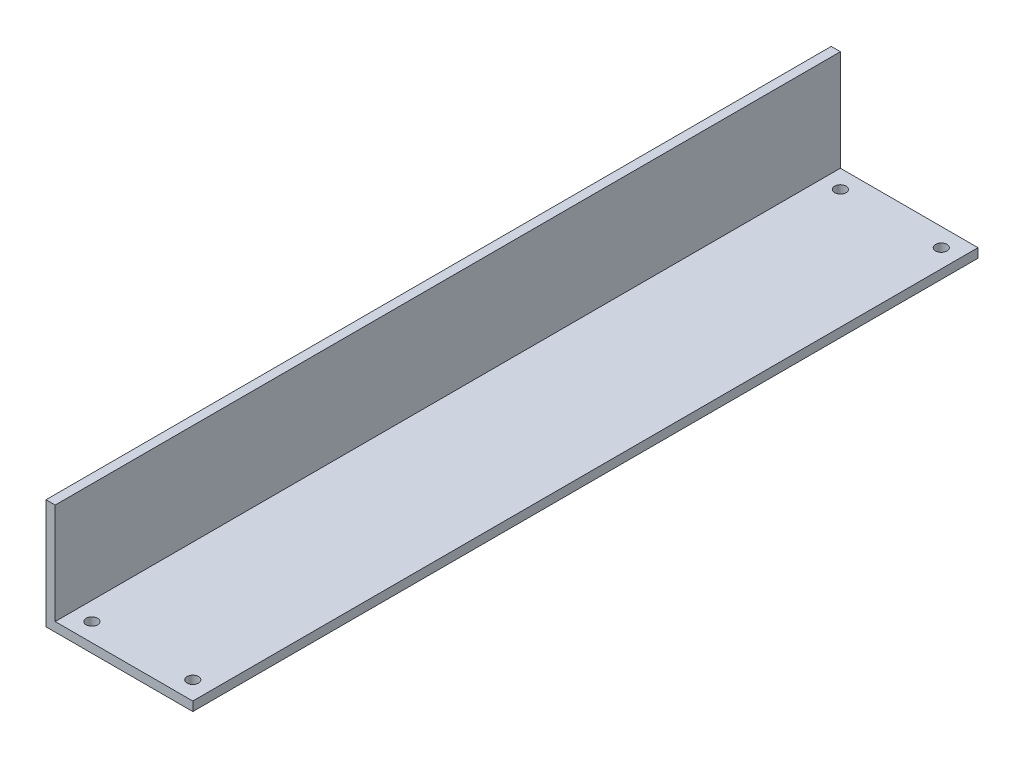
ISO-10303-21;
HEADER;
FILE_DESCRIPTION(('STEP AP214'),'2;1');
FILE_NAME('part.step','',(''),(''),'','','');
FILE_SCHEMA(('AUTOMOTIVE_DESIGN { 1 0 10303 214 1 1 1 1 }'));
ENDSEC;
DATA;
#1=APPLICATION_CONTEXT('core data for automotive mechanical design processes');
#2=APPLICATION_PROTOCOL_DEFINITION('international standard','automotive_design',2000,#1);
#3=PRODUCT_CONTEXT('',#1,'mechanical');
#4=PRODUCT('Part','Part','',(#3));
#5=PRODUCT_RELATED_PRODUCT_CATEGORY('part','',(#4));
#6=PRODUCT_DEFINITION_FORMATION('','',#4);
#7=PRODUCT_DEFINITION_CONTEXT('part definition',#1,'design');
#8=PRODUCT_DEFINITION('design','',#6,#7);
#9=PRODUCT_DEFINITION_SHAPE('','',#8);
#10=(LENGTH_UNIT() NAMED_UNIT(*) SI_UNIT(.MILLI.,.METRE.));
#11=(NAMED_UNIT(*) PLANE_ANGLE_UNIT() SI_UNIT($,.RADIAN.));
#12=(NAMED_UNIT(*) SI_UNIT($,.STERADIAN.) SOLID_ANGLE_UNIT());
#13=UNCERTAINTY_MEASURE_WITH_UNIT(LENGTH_MEASURE(1.E-05),#10,'distance_accuracy_value','');
#14=(GEOMETRIC_REPRESENTATION_CONTEXT(3) GLOBAL_UNCERTAINTY_ASSIGNED_CONTEXT((#13)) GLOBAL_UNIT_ASSIGNED_CONTEXT((#10,
#11,#12)) REPRESENTATION_CONTEXT('',''));
#15=CARTESIAN_POINT('',(0.,0.,0.));
#16=DIRECTION('',(0.,0.,1.));
#17=DIRECTION('',(1.,0.,0.));
#18=AXIS2_PLACEMENT_3D('',#15,#16,#17);
#19=CARTESIAN_POINT('',(25.4,76.2,683.199999999988));
#20=DIRECTION('',(0.,1.,0.));
#21=DIRECTION('',(0.,0.,1.));
#22=AXIS2_PLACEMENT_3D('',#19,#20,#21);
#23=PLANE('',#22);
#24=DIRECTION('',(0.,0.,-1.));
#25=VECTOR('',#24,1.);
#26=CARTESIAN_POINT('',(0.,76.2,683.199999999988));
#27=LINE('',#26,#25);
#28=CARTESIAN_POINT('',(0.,76.2,543.499999999988));
#29=VERTEX_POINT('',#28);
#30=CARTESIAN_POINT('',(0.,76.2,0.));
#31=VERTEX_POINT('',#30);
#32=EDGE_CURVE('E92',#29,#31,#27,.T.);
#33=ORIENTED_EDGE('',*,*,#32,.F.);
#34=DIRECTION('',(1.,0.,0.));
#35=VECTOR('',#34,1.);
#36=CARTESIAN_POINT('',(25.4,76.2,543.499999999988));
#37=LINE('',#36,#35);
#38=CARTESIAN_POINT('',(6.34999999999998,76.2,543.499999999988));
#39=VERTEX_POINT('',#38);
#40=EDGE_CURVE('E142',#29,#39,#37,.T.);
#41=ORIENTED_EDGE('',*,*,#40,.T.);
#42=DIRECTION('',(0.,0.,-1.));
#43=VECTOR('',#42,1.);
#44=CARTESIAN_POINT('',(6.34999999999998,76.2,683.199999999988));
#45=LINE('',#44,#43);
#46=CARTESIAN_POINT('',(6.34999999999998,76.2,0.));
#47=VERTEX_POINT('',#46);
#48=EDGE_CURVE('E62',#39,#47,#45,.T.);
#49=ORIENTED_EDGE('',*,*,#48,.T.);
#50=DIRECTION('',(1.,0.,0.));
#51=VECTOR('',#50,1.);
#52=CARTESIAN_POINT('',(25.4,76.2,0.));
#53=LINE('',#52,#51);
#54=EDGE_CURVE('E134',#31,#47,#53,.T.);
#55=ORIENTED_EDGE('',*,*,#54,.F.);
#56=EDGE_LOOP('',(#33,#41,#49,#55));
#57=FACE_BOUND('',#56,.T.);
#58=ADVANCED_FACE('F42',(#57),#23,.T.);
#59=CARTESIAN_POINT('',(0.,-109.647675221646,683.199999999988));
#60=DIRECTION('',(-1.,0.,0.));
#61=DIRECTION('',(0.,-1.,0.));
#62=AXIS2_PLACEMENT_3D('',#59,#60,#61);
#63=PLANE('',#62);
#64=DIRECTION('',(0.,0.,-1.));
#65=VECTOR('',#64,1.);
#66=CARTESIAN_POINT('',(0.,0.,683.199999999988));
#67=LINE('',#66,#65);
#68=CARTESIAN_POINT('',(0.,0.,543.499999999988));
#69=VERTEX_POINT('',#68);
#70=CARTESIAN_POINT('',(0.,0.,0.));
#71=VERTEX_POINT('',#70);
#72=EDGE_CURVE('E148',#69,#71,#67,.T.);
#73=ORIENTED_EDGE('',*,*,#72,.F.);
#74=DIRECTION('',(0.,1.,0.));
#75=VECTOR('',#74,1.);
#76=CARTESIAN_POINT('',(0.,-109.647675221646,543.499999999988));
#77=LINE('',#76,#75);
#78=EDGE_CURVE('E99',#69,#29,#77,.T.);
#79=ORIENTED_EDGE('',*,*,#78,.T.);
#80=ORIENTED_EDGE('',*,*,#32,.T.);
#81=DIRECTION('',(0.,1.,0.));
#82=VECTOR('',#81,1.);
#83=CARTESIAN_POINT('',(0.,-109.647675221646,0.));
#84=LINE('',#83,#82);
#85=EDGE_CURVE('E139',#71,#31,#84,.T.);
#86=ORIENTED_EDGE('',*,*,#85,.F.);
#87=EDGE_LOOP('',(#73,#79,#80,#86));
#88=FACE_BOUND('',#87,.T.);
#89=ADVANCED_FACE('F189',(#88),#63,.T.);
#90=CARTESIAN_POINT('',(25.4,0.,683.199999999988));
#91=DIRECTION('',(0.,1.,0.));
#92=DIRECTION('',(0.,0.,1.));
#93=AXIS2_PLACEMENT_3D('',#90,#91,#92);
#94=PLANE('',#93);
#95=CARTESIAN_POINT('',(88.9,0.,12.7));
#96=DIRECTION('',(0.,-1.,0.));
#97=DIRECTION('',(0.,0.,-1.));
#98=AXIS2_PLACEMENT_3D('',#95,#96,#97);
#99=CIRCLE('',#98,3.96875000000006);
#100=CARTESIAN_POINT('',(88.9,0.,8.73124999999996));
#101=VERTEX_POINT('',#100);
#102=EDGE_CURVE('E172',#101,#101,#99,.T.);
#103=ORIENTED_EDGE('',*,*,#102,.F.);
#104=EDGE_LOOP('',(#103));
#105=FACE_BOUND('',#104,.T.);
#106=CARTESIAN_POINT('',(19.05,0.,12.7));
#107=DIRECTION('',(0.,-1.,0.));
#108=DIRECTION('',(0.,0.,-1.));
#109=AXIS2_PLACEMENT_3D('',#106,#107,#108);
#110=CIRCLE('',#109,3.96874999999995);
#111=CARTESIAN_POINT('',(19.05,0.,8.73125000000001));
#112=VERTEX_POINT('',#111);
#113=EDGE_CURVE('E162',#112,#112,#110,.T.);
#114=ORIENTED_EDGE('',*,*,#113,.F.);
#115=EDGE_LOOP('',(#114));
#116=FACE_BOUND('',#115,.T.);
#117=CARTESIAN_POINT('',(19.0500000000011,0.,530.799999999992));
#118=DIRECTION('',(0.,-1.,0.));
#119=DIRECTION('',(0.,0.,-1.));
#120=AXIS2_PLACEMENT_3D('',#117,#118,#119);
#121=CIRCLE('',#120,3.9687499999999);
#122=CARTESIAN_POINT('',(19.0500000000011,0.,526.831249999992));
#123=VERTEX_POINT('',#122);
#124=EDGE_CURVE('E159',#123,#123,#121,.T.);
#125=ORIENTED_EDGE('',*,*,#124,.F.);
#126=EDGE_LOOP('',(#125));
#127=FACE_BOUND('',#126,.T.);
#128=CARTESIAN_POINT('',(88.9000000000009,0.,530.799999999942));
#129=DIRECTION('',(0.,-1.,0.));
#130=DIRECTION('',(0.,0.,-1.));
#131=AXIS2_PLACEMENT_3D('',#128,#129,#130);
#132=CIRCLE('',#131,3.96875000000001);
#133=CARTESIAN_POINT('',(88.9000000000009,0.,526.831249999942));
#134=VERTEX_POINT('',#133);
#135=EDGE_CURVE('E156',#134,#134,#132,.T.);
#136=ORIENTED_EDGE('',*,*,#135,.F.);
#137=EDGE_LOOP('',(#136));
#138=FACE_BOUND('',#137,.T.);
#139=DIRECTION('',(1.,0.,0.));
#140=VECTOR('',#139,1.);
#141=CARTESIAN_POINT('',(25.4,0.,543.499999999988));
#142=LINE('',#141,#140);
#143=CARTESIAN_POINT('',(101.6,0.,543.499999999988));
#144=VERTEX_POINT('',#143);
#145=EDGE_CURVE('E52',#69,#144,#142,.T.);
#146=ORIENTED_EDGE('',*,*,#145,.F.);
#147=ORIENTED_EDGE('',*,*,#72,.T.);
#148=DIRECTION('',(1.,0.,0.));
#149=VECTOR('',#148,1.);
#150=CARTESIAN_POINT('',(25.4,0.,0.));
#151=LINE('',#150,#149);
#152=CARTESIAN_POINT('',(101.6,0.,0.));
#153=VERTEX_POINT('',#152);
#154=EDGE_CURVE('E137',#71,#153,#151,.T.);
#155=ORIENTED_EDGE('',*,*,#154,.T.);
#156=DIRECTION('',(0.,0.,-1.));
#157=VECTOR('',#156,1.);
#158=CARTESIAN_POINT('',(101.6,0.,683.199999999988));
#159=LINE('',#158,#157);
#160=EDGE_CURVE('E124',#144,#153,#159,.T.);
#161=ORIENTED_EDGE('',*,*,#160,.F.);
#162=EDGE_LOOP('',(#146,#147,#155,#161));
#163=FACE_BOUND('',#162,.T.);
#164=ADVANCED_FACE('F196',(#105,#116,#127,#138,#163),#94,.F.);
#165=CARTESIAN_POINT('',(101.6,-109.647675221646,683.199999999988));
#166=DIRECTION('',(1.,0.,0.));
#167=DIRECTION('',(0.,0.,-1.));
#168=AXIS2_PLACEMENT_3D('',#165,#166,#167);
#169=PLANE('',#168);
#170=DIRECTION('',(0.,0.,-1.));
#171=VECTOR('',#170,1.);
#172=CARTESIAN_POINT('',(101.6,6.34999999999999,683.199999999988));
#173=LINE('',#172,#171);
#174=CARTESIAN_POINT('',(101.6,6.34999999999999,543.499999999988));
#175=VERTEX_POINT('',#174);
#176=CARTESIAN_POINT('',(101.6,6.34999999999999,0.));
#177=VERTEX_POINT('',#176);
#178=EDGE_CURVE('E115',#175,#177,#173,.T.);
#179=ORIENTED_EDGE('',*,*,#178,.F.);
#180=DIRECTION('',(0.,-1.,0.));
#181=VECTOR('',#180,1.);
#182=CARTESIAN_POINT('',(101.6,-109.647675221646,543.499999999988));
#183=LINE('',#182,#181);
#184=EDGE_CURVE('E122',#175,#144,#183,.T.);
#185=ORIENTED_EDGE('',*,*,#184,.T.);
#186=ORIENTED_EDGE('',*,*,#160,.T.);
#187=DIRECTION('',(0.,-1.,0.));
#188=VECTOR('',#187,1.);
#189=CARTESIAN_POINT('',(101.6,-109.647675221646,0.));
#190=LINE('',#189,#188);
#191=EDGE_CURVE('E180',#177,#153,#190,.T.);
#192=ORIENTED_EDGE('',*,*,#191,.F.);
#193=EDGE_LOOP('',(#179,#185,#186,#192));
#194=FACE_BOUND('',#193,.T.);
#195=ADVANCED_FACE('F194',(#194),#169,.T.);
#196=CARTESIAN_POINT('',(25.4,6.34999999999999,683.199999999988));
#197=DIRECTION('',(0.,1.,0.));
#198=DIRECTION('',(0.,0.,1.));
#199=AXIS2_PLACEMENT_3D('',#196,#197,#198);
#200=PLANE('',#199);
#201=CARTESIAN_POINT('',(88.9,6.34999999999999,12.7));
#202=DIRECTION('',(0.,1.,0.));
#203=DIRECTION('',(0.,0.,1.));
#204=AXIS2_PLACEMENT_3D('',#201,#202,#203);
#205=CIRCLE('',#204,3.96875000000006);
#206=CARTESIAN_POINT('',(88.9,6.34999999999999,16.6687500000001));
#207=VERTEX_POINT('',#206);
#208=EDGE_CURVE('E46',#207,#207,#205,.T.);
#209=ORIENTED_EDGE('',*,*,#208,.F.);
#210=EDGE_LOOP('',(#209));
#211=FACE_BOUND('',#210,.T.);
#212=CARTESIAN_POINT('',(19.05,6.34999999999999,12.7));
#213=DIRECTION('',(0.,1.,0.));
#214=DIRECTION('',(0.,0.,1.));
#215=AXIS2_PLACEMENT_3D('',#212,#213,#214);
#216=CIRCLE('',#215,3.96874999999995);
#217=CARTESIAN_POINT('',(19.05,6.34999999999999,16.6687499999999));
#218=VERTEX_POINT('',#217);
#219=EDGE_CURVE('E160',#218,#218,#216,.T.);
#220=ORIENTED_EDGE('',*,*,#219,.F.);
#221=EDGE_LOOP('',(#220));
#222=FACE_BOUND('',#221,.T.);
#223=CARTESIAN_POINT('',(19.0500000000011,6.34999999999999,530.799999999992));
#224=DIRECTION('',(0.,1.,0.));
#225=DIRECTION('',(0.,0.,1.));
#226=AXIS2_PLACEMENT_3D('',#223,#224,#225);
#227=CIRCLE('',#226,3.9687499999999);
#228=CARTESIAN_POINT('',(19.0500000000011,6.34999999999999,534.768749999991));
#229=VERTEX_POINT('',#228);
#230=EDGE_CURVE('E157',#229,#229,#227,.T.);
#231=ORIENTED_EDGE('',*,*,#230,.F.);
#232=EDGE_LOOP('',(#231));
#233=FACE_BOUND('',#232,.T.);
#234=CARTESIAN_POINT('',(88.9000000000009,6.34999999999999,530.799999999942));
#235=DIRECTION('',(0.,1.,0.));
#236=DIRECTION('',(0.,0.,1.));
#237=AXIS2_PLACEMENT_3D('',#234,#235,#236);
#238=CIRCLE('',#237,3.96875000000001);
#239=CARTESIAN_POINT('',(88.9000000000009,6.34999999999999,534.768749999942));
#240=VERTEX_POINT('',#239);
#241=EDGE_CURVE('E144',#240,#240,#238,.T.);
#242=ORIENTED_EDGE('',*,*,#241,.F.);
#243=EDGE_LOOP('',(#242));
#244=FACE_BOUND('',#243,.T.);
#245=DIRECTION('',(0.,0.,-1.));
#246=VECTOR('',#245,1.);
#247=CARTESIAN_POINT('',(6.35,6.34999999999999,683.199999999988));
#248=LINE('',#247,#246);
#249=CARTESIAN_POINT('',(6.35,6.34999999999999,543.499999999988));
#250=VERTEX_POINT('',#249);
#251=CARTESIAN_POINT('',(6.35,6.34999999999999,0.));
#252=VERTEX_POINT('',#251);
#253=EDGE_CURVE('E68',#250,#252,#248,.T.);
#254=ORIENTED_EDGE('',*,*,#253,.F.);
#255=DIRECTION('',(1.,0.,0.));
#256=VECTOR('',#255,1.);
#257=CARTESIAN_POINT('',(25.4,6.34999999999999,543.499999999988));
#258=LINE('',#257,#256);
#259=EDGE_CURVE('E107',#250,#175,#258,.T.);
#260=ORIENTED_EDGE('',*,*,#259,.T.);
#261=ORIENTED_EDGE('',*,*,#178,.T.);
#262=DIRECTION('',(1.,0.,0.));
#263=VECTOR('',#262,1.);
#264=CARTESIAN_POINT('',(25.4,6.34999999999999,0.));
#265=LINE('',#264,#263);
#266=EDGE_CURVE('E112',#252,#177,#265,.T.);
#267=ORIENTED_EDGE('',*,*,#266,.F.);
#268=EDGE_LOOP('',(#254,#260,#261,#267));
#269=FACE_BOUND('',#268,.T.);
#270=ADVANCED_FACE('F110',(#211,#222,#233,#244,#269),#200,.T.);
#271=CARTESIAN_POINT('',(6.35000000000002,-109.647675221646,683.199999999988));
#272=DIRECTION('',(-1.,0.,0.));
#273=DIRECTION('',(0.,-1.,0.));
#274=AXIS2_PLACEMENT_3D('',#271,#272,#273);
#275=PLANE('',#274);
#276=DIRECTION('',(0.,1.,0.));
#277=VECTOR('',#276,1.);
#278=CARTESIAN_POINT('',(6.35000000000002,-109.647675221646,543.499999999988));
#279=LINE('',#278,#277);
#280=EDGE_CURVE('E12',#250,#39,#279,.T.);
#281=ORIENTED_EDGE('',*,*,#280,.F.);
#282=ORIENTED_EDGE('',*,*,#253,.T.);
#283=DIRECTION('',(0.,1.,0.));
#284=VECTOR('',#283,1.);
#285=CARTESIAN_POINT('',(6.35000000000002,-109.647675221646,0.));
#286=LINE('',#285,#284);
#287=EDGE_CURVE('E114',#252,#47,#286,.T.);
#288=ORIENTED_EDGE('',*,*,#287,.T.);
#289=ORIENTED_EDGE('',*,*,#48,.F.);
#290=EDGE_LOOP('',(#281,#282,#288,#289));
#291=FACE_BOUND('',#290,.T.);
#292=ADVANCED_FACE('F117',(#291),#275,.F.);
#293=CARTESIAN_POINT('',(25.4,-109.647675221646,0.));
#294=DIRECTION('',(0.,0.,1.));
#295=DIRECTION('',(1.,0.,0.));
#296=AXIS2_PLACEMENT_3D('',#293,#294,#295);
#297=PLANE('',#296);
#298=ORIENTED_EDGE('',*,*,#54,.T.);
#299=ORIENTED_EDGE('',*,*,#287,.F.);
#300=ORIENTED_EDGE('',*,*,#266,.T.);
#301=ORIENTED_EDGE('',*,*,#191,.T.);
#302=ORIENTED_EDGE('',*,*,#154,.F.);
#303=ORIENTED_EDGE('',*,*,#85,.T.);
#304=EDGE_LOOP('',(#298,#299,#300,#301,#302,#303));
#305=FACE_BOUND('',#304,.T.);
#306=ADVANCED_FACE('F188',(#305),#297,.F.);
#307=CARTESIAN_POINT('',(206.179160264318,95.9611999999439,543.499999999988));
#308=DIRECTION('',(0.,0.,1.));
#309=DIRECTION('',(1.,0.,0.));
#310=AXIS2_PLACEMENT_3D('',#307,#308,#309);
#311=PLANE('',#310);
#312=ORIENTED_EDGE('',*,*,#40,.F.);
#313=ORIENTED_EDGE('',*,*,#78,.F.);
#314=ORIENTED_EDGE('',*,*,#145,.T.);
#315=ORIENTED_EDGE('',*,*,#184,.F.);
#316=ORIENTED_EDGE('',*,*,#259,.F.);
#317=ORIENTED_EDGE('',*,*,#280,.T.);
#318=EDGE_LOOP('',(#312,#313,#314,#315,#316,#317));
#319=FACE_BOUND('',#318,.T.);
#320=ADVANCED_FACE('F44',(#319),#311,.T.);
#321=CARTESIAN_POINT('',(88.9000000000009,76.2,530.799999999942));
#322=DIRECTION('',(0.,-1.,0.));
#323=DIRECTION('',(0.,0.,-1.));
#324=AXIS2_PLACEMENT_3D('',#321,#322,#323);
#325=CYLINDRICAL_SURFACE('',#324,3.96875000000001);
#326=ORIENTED_EDGE('',*,*,#241,.T.);
#327=EDGE_LOOP('',(#326));
#328=FACE_BOUND('',#327,.T.);
#329=ORIENTED_EDGE('',*,*,#135,.T.);
#330=EDGE_LOOP('',(#329));
#331=FACE_BOUND('',#330,.T.);
#332=ADVANCED_FACE('F246',(#328,#331),#325,.F.);
#333=CARTESIAN_POINT('',(19.0500000000011,76.2,530.799999999992));
#334=DIRECTION('',(0.,-1.,0.));
#335=DIRECTION('',(0.,0.,-1.));
#336=AXIS2_PLACEMENT_3D('',#333,#334,#335);
#337=CYLINDRICAL_SURFACE('',#336,3.9687499999999);
#338=ORIENTED_EDGE('',*,*,#230,.T.);
#339=EDGE_LOOP('',(#338));
#340=FACE_BOUND('',#339,.T.);
#341=ORIENTED_EDGE('',*,*,#124,.T.);
#342=EDGE_LOOP('',(#341));
#343=FACE_BOUND('',#342,.T.);
#344=ADVANCED_FACE('F251',(#340,#343),#337,.F.);
#345=CARTESIAN_POINT('',(19.05,76.2,12.7));
#346=DIRECTION('',(0.,-1.,0.));
#347=DIRECTION('',(0.,0.,-1.));
#348=AXIS2_PLACEMENT_3D('',#345,#346,#347);
#349=CYLINDRICAL_SURFACE('',#348,3.96874999999995);
#350=ORIENTED_EDGE('',*,*,#219,.T.);
#351=EDGE_LOOP('',(#350));
#352=FACE_BOUND('',#351,.T.);
#353=ORIENTED_EDGE('',*,*,#113,.T.);
#354=EDGE_LOOP('',(#353));
#355=FACE_BOUND('',#354,.T.);
#356=ADVANCED_FACE('F259',(#352,#355),#349,.F.);
#357=CARTESIAN_POINT('',(88.9,76.2,12.7));
#358=DIRECTION('',(0.,-1.,0.));
#359=DIRECTION('',(0.,0.,-1.));
#360=AXIS2_PLACEMENT_3D('',#357,#358,#359);
#361=CYLINDRICAL_SURFACE('',#360,3.96875000000006);
#362=ORIENTED_EDGE('',*,*,#208,.T.);
#363=EDGE_LOOP('',(#362));
#364=FACE_BOUND('',#363,.T.);
#365=ORIENTED_EDGE('',*,*,#102,.T.);
#366=EDGE_LOOP('',(#365));
#367=FACE_BOUND('',#366,.T.);
#368=ADVANCED_FACE('F267',(#364,#367),#361,.F.);
#369=CLOSED_SHELL('',(#58,#89,#164,#195,#270,#292,#306,#320,#332,#344,#356,#368));
#370=MANIFOLD_SOLID_BREP('B2',#369);
#371=ADVANCED_BREP_SHAPE_REPRESENTATION('',(#18,#370),#14);
#372=SHAPE_DEFINITION_REPRESENTATION(#9,#371);
ENDSEC;
END-ISO-10303-21;
